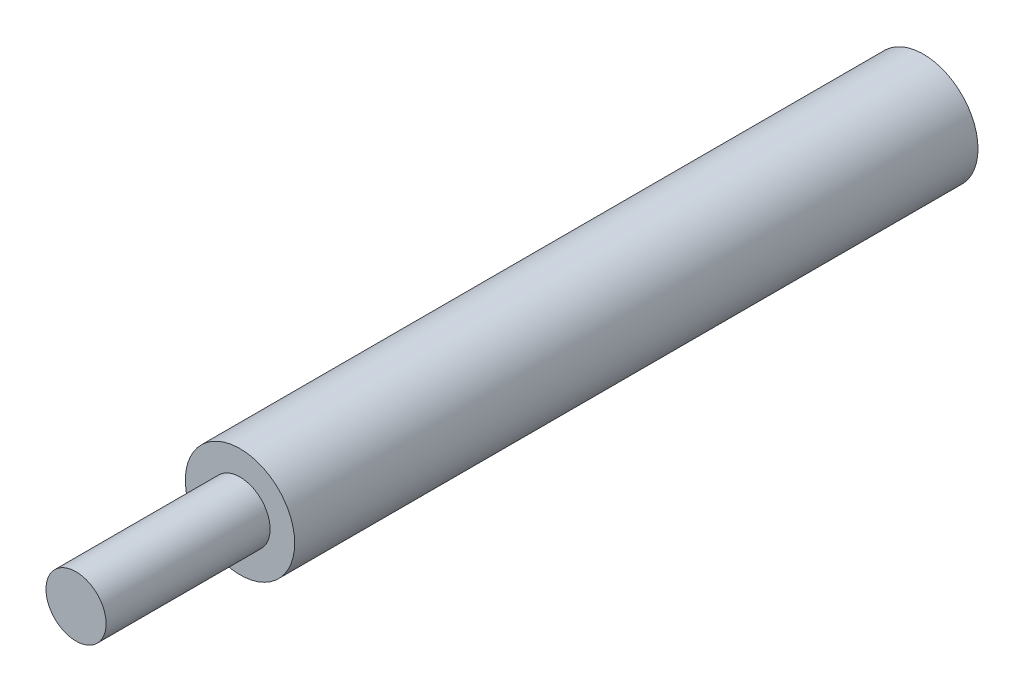
ISO-10303-21;
HEADER;
FILE_DESCRIPTION(('STEP AP214'),'2;1');
FILE_NAME('part.step','',(''),(''),'','','');
FILE_SCHEMA(('AUTOMOTIVE_DESIGN { 1 0 10303 214 1 1 1 1 }'));
ENDSEC;
DATA;
#1=APPLICATION_CONTEXT('core data for automotive mechanical design processes');
#2=APPLICATION_PROTOCOL_DEFINITION('international standard','automotive_design',2000,#1);
#3=PRODUCT_CONTEXT('',#1,'mechanical');
#4=PRODUCT('Part','Part','',(#3));
#5=PRODUCT_RELATED_PRODUCT_CATEGORY('part','',(#4));
#6=PRODUCT_DEFINITION_FORMATION('','',#4);
#7=PRODUCT_DEFINITION_CONTEXT('part definition',#1,'design');
#8=PRODUCT_DEFINITION('design','',#6,#7);
#9=PRODUCT_DEFINITION_SHAPE('','',#8);
#10=(LENGTH_UNIT() NAMED_UNIT(*) SI_UNIT(.MILLI.,.METRE.));
#11=(NAMED_UNIT(*) PLANE_ANGLE_UNIT() SI_UNIT($,.RADIAN.));
#12=(NAMED_UNIT(*) SI_UNIT($,.STERADIAN.) SOLID_ANGLE_UNIT());
#13=UNCERTAINTY_MEASURE_WITH_UNIT(LENGTH_MEASURE(1.E-05),#10,'distance_accuracy_value','');
#14=(GEOMETRIC_REPRESENTATION_CONTEXT(3) GLOBAL_UNCERTAINTY_ASSIGNED_CONTEXT((#13)) GLOBAL_UNIT_ASSIGNED_CONTEXT((#10,
#11,#12)) REPRESENTATION_CONTEXT('',''));
#15=CARTESIAN_POINT('',(0.,0.,0.));
#16=DIRECTION('',(0.,0.,1.));
#17=DIRECTION('',(1.,0.,0.));
#18=AXIS2_PLACEMENT_3D('',#15,#16,#17);
#19=CARTESIAN_POINT('',(0.,0.,50.));
#20=DIRECTION('',(0.,0.,-1.));
#21=DIRECTION('',(-1.,0.,0.));
#22=AXIS2_PLACEMENT_3D('',#19,#20,#21);
#23=CYLINDRICAL_SURFACE('',#22,4.);
#24=CARTESIAN_POINT('',(0.,0.,50.));
#25=DIRECTION('',(0.,0.,1.));
#26=DIRECTION('',(1.,0.,0.));
#27=AXIS2_PLACEMENT_3D('',#24,#25,#26);
#28=CIRCLE('',#27,4.);
#29=CARTESIAN_POINT('',(4.,0.,50.));
#30=VERTEX_POINT('',#29);
#31=EDGE_CURVE('E45',#30,#30,#28,.T.);
#32=ORIENTED_EDGE('',*,*,#31,.F.);
#33=EDGE_LOOP('',(#32));
#34=FACE_BOUND('',#33,.T.);
#35=CARTESIAN_POINT('',(0.,0.,0.));
#36=DIRECTION('',(0.,0.,1.));
#37=DIRECTION('',(1.,0.,0.));
#38=AXIS2_PLACEMENT_3D('',#35,#36,#37);
#39=CIRCLE('',#38,4.);
#40=CARTESIAN_POINT('',(4.,0.,0.));
#41=VERTEX_POINT('',#40);
#42=EDGE_CURVE('E41',#41,#41,#39,.T.);
#43=ORIENTED_EDGE('',*,*,#42,.T.);
#44=EDGE_LOOP('',(#43));
#45=FACE_BOUND('',#44,.T.);
#46=ADVANCED_FACE('F38',(#34,#45),#23,.T.);
#47=CARTESIAN_POINT('',(0.,0.,50.));
#48=DIRECTION('',(0.,0.,1.));
#49=DIRECTION('',(1.,0.,0.));
#50=AXIS2_PLACEMENT_3D('',#47,#48,#49);
#51=PLANE('',#50);
#52=CARTESIAN_POINT('',(0.,0.,50.));
#53=DIRECTION('',(0.,0.,1.));
#54=DIRECTION('',(1.,0.,0.));
#55=AXIS2_PLACEMENT_3D('',#52,#53,#54);
#56=CIRCLE('',#55,2.2);
#57=CARTESIAN_POINT('',(2.2,0.,50.));
#58=VERTEX_POINT('',#57);
#59=EDGE_CURVE('E10',#58,#58,#56,.T.);
#60=ORIENTED_EDGE('',*,*,#59,.F.);
#61=EDGE_LOOP('',(#60));
#62=FACE_BOUND('',#61,.T.);
#63=ORIENTED_EDGE('',*,*,#31,.T.);
#64=EDGE_LOOP('',(#63));
#65=FACE_BOUND('',#64,.T.);
#66=ADVANCED_FACE('F62',(#62,#65),#51,.T.);
#67=CARTESIAN_POINT('',(0.,0.,0.));
#68=DIRECTION('',(0.,0.,1.));
#69=DIRECTION('',(1.,0.,0.));
#70=AXIS2_PLACEMENT_3D('',#67,#68,#69);
#71=PLANE('',#70);
#72=ORIENTED_EDGE('',*,*,#42,.F.);
#73=EDGE_LOOP('',(#72));
#74=FACE_BOUND('',#73,.T.);
#75=ADVANCED_FACE('F59',(#74),#71,.F.);
#76=CARTESIAN_POINT('',(0.,0.,62.));
#77=DIRECTION('',(0.,0.,-1.));
#78=DIRECTION('',(-1.,0.,0.));
#79=AXIS2_PLACEMENT_3D('',#76,#77,#78);
#80=CYLINDRICAL_SURFACE('',#79,2.2);
#81=CARTESIAN_POINT('',(0.,0.,62.));
#82=DIRECTION('',(0.,0.,1.));
#83=DIRECTION('',(1.,0.,0.));
#84=AXIS2_PLACEMENT_3D('',#81,#82,#83);
#85=CIRCLE('',#84,2.2);
#86=CARTESIAN_POINT('',(2.2,0.,62.));
#87=VERTEX_POINT('',#86);
#88=EDGE_CURVE('E51',#87,#87,#85,.T.);
#89=ORIENTED_EDGE('',*,*,#88,.F.);
#90=EDGE_LOOP('',(#89));
#91=FACE_BOUND('',#90,.T.);
#92=ORIENTED_EDGE('',*,*,#59,.T.);
#93=EDGE_LOOP('',(#92));
#94=FACE_BOUND('',#93,.T.);
#95=ADVANCED_FACE('F61',(#91,#94),#80,.T.);
#96=CARTESIAN_POINT('',(0.,0.,62.));
#97=DIRECTION('',(0.,0.,1.));
#98=DIRECTION('',(1.,0.,0.));
#99=AXIS2_PLACEMENT_3D('',#96,#97,#98);
#100=PLANE('',#99);
#101=ORIENTED_EDGE('',*,*,#88,.T.);
#102=EDGE_LOOP('',(#101));
#103=FACE_BOUND('',#102,.T.);
#104=ADVANCED_FACE('F67',(#103),#100,.T.);
#105=CLOSED_SHELL('',(#46,#66,#75,#95,#104));
#106=MANIFOLD_SOLID_BREP('B2',#105);
#107=ADVANCED_BREP_SHAPE_REPRESENTATION('',(#18,#106),#14);
#108=SHAPE_DEFINITION_REPRESENTATION(#9,#107);
ENDSEC;
END-ISO-10303-21;
